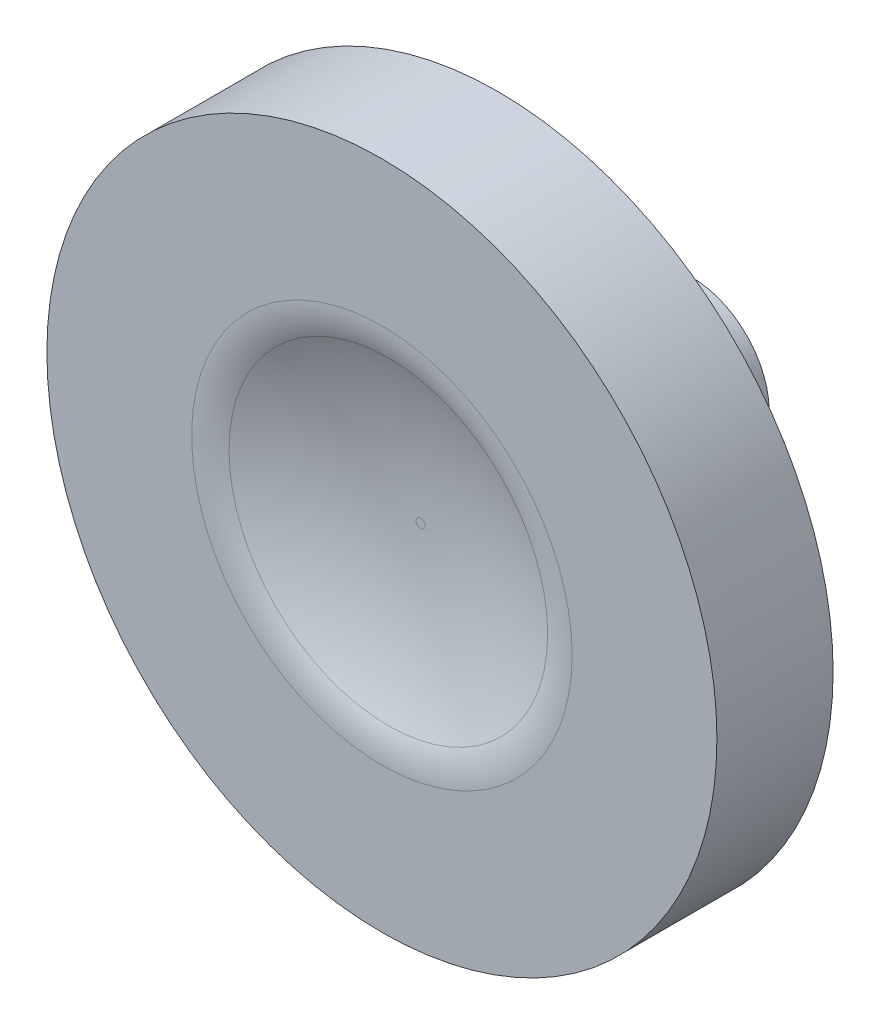
ISO-10303-21;
HEADER;
FILE_DESCRIPTION(('STEP AP214'),'2;1');
FILE_NAME('part.step','',(''),(''),'','','');
FILE_SCHEMA(('AUTOMOTIVE_DESIGN { 1 0 10303 214 1 1 1 1 }'));
ENDSEC;
DATA;
#1=APPLICATION_CONTEXT('core data for automotive mechanical design processes');
#2=APPLICATION_PROTOCOL_DEFINITION('international standard','automotive_design',2000,#1);
#3=PRODUCT_CONTEXT('',#1,'mechanical');
#4=PRODUCT('Part','Part','',(#3));
#5=PRODUCT_RELATED_PRODUCT_CATEGORY('part','',(#4));
#6=PRODUCT_DEFINITION_FORMATION('','',#4);
#7=PRODUCT_DEFINITION_CONTEXT('part definition',#1,'design');
#8=PRODUCT_DEFINITION('design','',#6,#7);
#9=PRODUCT_DEFINITION_SHAPE('','',#8);
#10=(LENGTH_UNIT() NAMED_UNIT(*) SI_UNIT(.MILLI.,.METRE.));
#11=(NAMED_UNIT(*) PLANE_ANGLE_UNIT() SI_UNIT($,.RADIAN.));
#12=(NAMED_UNIT(*) SI_UNIT($,.STERADIAN.) SOLID_ANGLE_UNIT());
#13=UNCERTAINTY_MEASURE_WITH_UNIT(LENGTH_MEASURE(1.E-05),#10,'distance_accuracy_value','');
#14=(GEOMETRIC_REPRESENTATION_CONTEXT(3) GLOBAL_UNCERTAINTY_ASSIGNED_CONTEXT((#13)) GLOBAL_UNIT_ASSIGNED_CONTEXT((#10,
#11,#12)) REPRESENTATION_CONTEXT('',''));
#15=CARTESIAN_POINT('',(0.,0.,0.));
#16=DIRECTION('',(0.,0.,1.));
#17=DIRECTION('',(1.,0.,0.));
#18=AXIS2_PLACEMENT_3D('',#15,#16,#17);
#19=CARTESIAN_POINT('',(0.,0.,2.54));
#20=DIRECTION('',(0.,0.,1.));
#21=DIRECTION('',(1.,0.,0.));
#22=AXIS2_PLACEMENT_3D('',#19,#20,#21);
#23=PLANE('',#22);
#24=CARTESIAN_POINT('',(0.,0.,2.54));
#25=DIRECTION('',(0.,0.,1.));
#26=DIRECTION('',(1.,0.,0.));
#27=AXIS2_PLACEMENT_3D('',#24,#25,#26);
#28=CIRCLE('',#27,0.14759849100532);
#29=CARTESIAN_POINT('',(0.14759849100532,0.,2.54));
#30=VERTEX_POINT('',#29);
#31=EDGE_CURVE('E41',#30,#30,#28,.T.);
#32=ORIENTED_EDGE('',*,*,#31,.T.);
#33=EDGE_LOOP('',(#32));
#34=FACE_BOUND('',#33,.T.);
#35=ADVANCED_FACE('F37',(#34),#23,.T.);
#36=CARTESIAN_POINT('',(0.,0.,3.81));
#37=DIRECTION('',(0.,0.,1.));
#38=DIRECTION('',(1.,0.,0.));
#39=AXIS2_PLACEMENT_3D('',#36,#37,#38);
#40=PLANE('',#39);
#41=CARTESIAN_POINT('',(0.,0.,3.81));
#42=DIRECTION('',(0.,0.,1.));
#43=DIRECTION('',(1.,0.,0.));
#44=AXIS2_PLACEMENT_3D('',#41,#42,#43);
#45=CIRCLE('',#44,6.23830452561247);
#46=CARTESIAN_POINT('',(6.23830452561247,0.,3.81));
#47=VERTEX_POINT('',#46);
#48=EDGE_CURVE('E63',#47,#47,#45,.F.);
#49=ORIENTED_EDGE('',*,*,#48,.T.);
#50=EDGE_LOOP('',(#49));
#51=FACE_BOUND('',#50,.T.);
#52=CARTESIAN_POINT('',(0.,0.,3.81));
#53=DIRECTION('',(0.,0.,1.));
#54=DIRECTION('',(1.,0.,0.));
#55=AXIS2_PLACEMENT_3D('',#52,#53,#54);
#56=CIRCLE('',#55,10.9855);
#57=CARTESIAN_POINT('',(-10.9855,0.,3.81));
#58=VERTEX_POINT('',#57);
#59=EDGE_CURVE('E60',#58,#58,#56,.T.);
#60=ORIENTED_EDGE('',*,*,#59,.T.);
#61=EDGE_LOOP('',(#60));
#62=FACE_BOUND('',#61,.T.);
#63=ADVANCED_FACE('F86',(#51,#62),#40,.T.);
#64=CARTESIAN_POINT('',(0.,0.,3.81));
#65=DIRECTION('',(0.,0.,-1.));
#66=DIRECTION('',(-1.,0.,0.));
#67=AXIS2_PLACEMENT_3D('',#64,#65,#66);
#68=CYLINDRICAL_SURFACE('',#67,10.9855);
#69=CARTESIAN_POINT('',(0.,0.,0.));
#70=DIRECTION('',(0.,0.,1.));
#71=DIRECTION('',(1.,0.,0.));
#72=AXIS2_PLACEMENT_3D('',#69,#70,#71);
#73=CIRCLE('',#72,10.9855);
#74=CARTESIAN_POINT('',(-10.9855,0.,0.));
#75=VERTEX_POINT('',#74);
#76=EDGE_CURVE('E56',#75,#75,#73,.T.);
#77=CARTESIAN_POINT('',(-10.9855,0.,3.81));
#78=CARTESIAN_POINT('',(-10.9855,0.,3.7703125));
#79=CARTESIAN_POINT('',(-10.9855,0.,3.730625));
#80=CARTESIAN_POINT('',(-10.9855,0.,3.65125));
#81=CARTESIAN_POINT('',(-10.9855,0.,3.6115625));
#82=CARTESIAN_POINT('',(-10.9855,0.,3.5321875));
#83=CARTESIAN_POINT('',(-10.9855,0.,3.4925));
#84=CARTESIAN_POINT('',(-10.9855,0.,3.413125));
#85=CARTESIAN_POINT('',(-10.9855,0.,3.3734375));
#86=CARTESIAN_POINT('',(-10.9855,0.,3.2940625));
#87=CARTESIAN_POINT('',(-10.9855,0.,3.254375));
#88=CARTESIAN_POINT('',(-10.9855,0.,3.175));
#89=CARTESIAN_POINT('',(-10.9855,0.,3.1353125));
#90=CARTESIAN_POINT('',(-10.9855,0.,3.0559375));
#91=CARTESIAN_POINT('',(-10.9855,0.,3.01625));
#92=CARTESIAN_POINT('',(-10.9855,0.,2.936875));
#93=CARTESIAN_POINT('',(-10.9855,0.,2.8971875));
#94=CARTESIAN_POINT('',(-10.9855,0.,2.8178125));
#95=CARTESIAN_POINT('',(-10.9855,0.,2.778125));
#96=CARTESIAN_POINT('',(-10.9855,0.,2.69875));
#97=CARTESIAN_POINT('',(-10.9855,0.,2.6590625));
#98=CARTESIAN_POINT('',(-10.9855,0.,2.5796875));
#99=CARTESIAN_POINT('',(-10.9855,0.,2.54));
#100=CARTESIAN_POINT('',(-10.9855,0.,2.460625));
#101=CARTESIAN_POINT('',(-10.9855,0.,2.4209375));
#102=CARTESIAN_POINT('',(-10.9855,0.,2.3415625));
#103=CARTESIAN_POINT('',(-10.9855,0.,2.301875));
#104=CARTESIAN_POINT('',(-10.9855,0.,2.2225));
#105=CARTESIAN_POINT('',(-10.9855,0.,2.1828125));
#106=CARTESIAN_POINT('',(-10.9855,0.,2.1034375));
#107=CARTESIAN_POINT('',(-10.9855,0.,2.06375));
#108=CARTESIAN_POINT('',(-10.9855,0.,1.984375));
#109=CARTESIAN_POINT('',(-10.9855,0.,1.9446875));
#110=CARTESIAN_POINT('',(-10.9855,0.,1.8653125));
#111=CARTESIAN_POINT('',(-10.9855,0.,1.825625));
#112=CARTESIAN_POINT('',(-10.9855,0.,1.74625));
#113=CARTESIAN_POINT('',(-10.9855,0.,1.7065625));
#114=CARTESIAN_POINT('',(-10.9855,0.,1.6271875));
#115=CARTESIAN_POINT('',(-10.9855,0.,1.5875));
#116=CARTESIAN_POINT('',(-10.9855,0.,1.508125));
#117=CARTESIAN_POINT('',(-10.9855,0.,1.4684375));
#118=CARTESIAN_POINT('',(-10.9855,0.,1.3890625));
#119=CARTESIAN_POINT('',(-10.9855,0.,1.349375));
#120=CARTESIAN_POINT('',(-10.9855,0.,1.27));
#121=CARTESIAN_POINT('',(-10.9855,0.,1.2303125));
#122=CARTESIAN_POINT('',(-10.9855,0.,1.1509375));
#123=CARTESIAN_POINT('',(-10.9855,0.,1.11125));
#124=CARTESIAN_POINT('',(-10.9855,0.,1.031875));
#125=CARTESIAN_POINT('',(-10.9855,0.,0.9921875));
#126=CARTESIAN_POINT('',(-10.9855,0.,0.9128125));
#127=CARTESIAN_POINT('',(-10.9855,0.,0.873125));
#128=CARTESIAN_POINT('',(-10.9855,0.,0.79375));
#129=CARTESIAN_POINT('',(-10.9855,0.,0.7540625));
#130=CARTESIAN_POINT('',(-10.9855,0.,0.6746875));
#131=CARTESIAN_POINT('',(-10.9855,0.,0.635));
#132=CARTESIAN_POINT('',(-10.9855,0.,0.555625));
#133=CARTESIAN_POINT('',(-10.9855,0.,0.5159375));
#134=CARTESIAN_POINT('',(-10.9855,0.,0.4365625));
#135=CARTESIAN_POINT('',(-10.9855,0.,0.396875));
#136=CARTESIAN_POINT('',(-10.9855,0.,0.3175));
#137=CARTESIAN_POINT('',(-10.9855,0.,0.2778125));
#138=CARTESIAN_POINT('',(-10.9855,0.,0.1984375));
#139=CARTESIAN_POINT('',(-10.9855,0.,0.15875));
#140=CARTESIAN_POINT('',(-10.9855,0.,0.0793749999999999));
#141=CARTESIAN_POINT('',(-10.9855,0.,0.0396874999999999));
#142=CARTESIAN_POINT('',(-10.9855,0.,0.));
#143=B_SPLINE_CURVE_WITH_KNOTS('',3,(#77,#78,#79,#80,#81,#82,#83,#84,#85,#86,#87,#88,#89,#90,
#91,#92,#93,#94,#95,#96,#97,#98,#99,#100,#101,#102,#103,#104,#105,#106,#107,#108,#109,#110,#111,
#112,#113,#114,#115,#116,#117,#118,#119,#120,#121,#122,#123,#124,#125,#126,#127,#128,#129,#130,
#131,#132,#133,#134,#135,#136,#137,#138,#139,#140,#141,#142),.UNSPECIFIED.,.F.,.F.,(4,2,2,2,2,2,
2,2,2,2,2,2,2,2,2,2,2,2,2,2,2,2,2,2,2,2,2,2,2,2,2,2,4),(0.,0.1190625,0.238125,0.3571875,0.47625,
0.5953125,0.714375,0.8334375,0.9525,1.0715625,1.190625,1.3096875,1.42875,1.5478125,1.666875,
1.7859375,1.905,2.0240625,2.143125,2.2621875,2.38125,2.5003125,2.619375,2.7384375,2.8575,
2.9765625,3.095625,3.2146875,3.33375,3.4528125,3.571875,3.6909375,3.81),.UNSPECIFIED.);
#144=EDGE_CURVE('BSEAM92',#58,#75,#143,.T.);
#145=ORIENTED_EDGE('',*,*,#59,.F.);
#146=ORIENTED_EDGE('',*,*,#76,.T.);
#147=ORIENTED_EDGE('',*,*,#144,.T.);
#148=ORIENTED_EDGE('',*,*,#144,.F.);
#149=EDGE_LOOP('',(#145,#147,#146,#148));
#150=FACE_BOUND('',#149,.T.);
#151=ADVANCED_FACE('F92',(#150),#68,.T.);
#152=CARTESIAN_POINT('',(0.,0.,0.));
#153=DIRECTION('',(0.,0.,1.));
#154=DIRECTION('',(1.,0.,0.));
#155=AXIS2_PLACEMENT_3D('',#152,#153,#154);
#156=PLANE('',#155);
#157=CARTESIAN_POINT('',(0.,0.,0.));
#158=DIRECTION('',(0.,0.,1.));
#159=DIRECTION('',(1.,0.,0.));
#160=AXIS2_PLACEMENT_3D('',#157,#158,#159);
#161=CIRCLE('',#160,4.0386);
#162=CARTESIAN_POINT('',(4.0386,0.,0.));
#163=VERTEX_POINT('',#162);
#164=EDGE_CURVE('E57',#163,#163,#161,.T.);
#165=ORIENTED_EDGE('',*,*,#164,.T.);
#166=EDGE_LOOP('',(#165));
#167=FACE_BOUND('',#166,.T.);
#168=ORIENTED_EDGE('',*,*,#76,.F.);
#169=EDGE_LOOP('',(#168));
#170=FACE_BOUND('',#169,.T.);
#171=ADVANCED_FACE('F83',(#167,#170),#156,.F.);
#172=CARTESIAN_POINT('',(0.,0.,1.27));
#173=DIRECTION('',(0.,0.,1.));
#174=DIRECTION('',(1.,0.,0.));
#175=AXIS2_PLACEMENT_3D('',#172,#173,#174);
#176=TOROIDAL_SURFACE('',#175,6.23830452561247,2.54);
#177=CARTESIAN_POINT('',(0.,0.,3.59833333333333));
#178=DIRECTION('',(0.,0.,-1.));
#179=DIRECTION('',(-1.,0.,0.));
#180=AXIS2_PLACEMENT_3D('',#177,#178,#179);
#181=CIRCLE('',#180,5.22318685317795);
#182=CARTESIAN_POINT('',(-5.22318685317795,0.,3.59833333333333));
#183=VERTEX_POINT('',#182);
#184=EDGE_CURVE('E49',#183,#183,#181,.T.);
#185=ORIENTED_EDGE('',*,*,#184,.T.);
#186=EDGE_LOOP('',(#185));
#187=FACE_BOUND('',#186,.T.);
#188=ORIENTED_EDGE('',*,*,#48,.F.);
#189=EDGE_LOOP('',(#188));
#190=FACE_BOUND('',#189,.T.);
#191=ADVANCED_FACE('F70',(#187,#190),#176,.T.);
#192=CARTESIAN_POINT('',(0.,0.,15.24));
#193=DIRECTION('',(0.,0.,-1.));
#194=DIRECTION('',(-1.,0.,0.));
#195=AXIS2_PLACEMENT_3D('',#192,#193,#194);
#196=DEGENERATE_TOROIDAL_SURFACE('',#195,0.14759849100532,12.7,.T.);
#197=ORIENTED_EDGE('',*,*,#31,.F.);
#198=EDGE_LOOP('',(#197));
#199=FACE_BOUND('',#198,.T.);
#200=ORIENTED_EDGE('',*,*,#184,.F.);
#201=EDGE_LOOP('',(#200));
#202=FACE_BOUND('',#201,.T.);
#203=ADVANCED_FACE('F39',(#199,#202),#196,.F.);
#204=CARTESIAN_POINT('',(0.,0.,-2.54));
#205=DIRECTION('',(0.,0.,1.));
#206=DIRECTION('',(1.,0.,0.));
#207=AXIS2_PLACEMENT_3D('',#204,#205,#206);
#208=CYLINDRICAL_SURFACE('',#207,4.0386);
#209=CARTESIAN_POINT('',(0.,0.,-2.54));
#210=DIRECTION('',(0.,0.,1.));
#211=DIRECTION('',(1.,0.,0.));
#212=AXIS2_PLACEMENT_3D('',#209,#210,#211);
#213=CIRCLE('',#212,4.0386);
#214=CARTESIAN_POINT('',(4.0386,0.,-2.54));
#215=VERTEX_POINT('',#214);
#216=EDGE_CURVE('E53',#215,#215,#213,.T.);
#217=ORIENTED_EDGE('',*,*,#216,.T.);
#218=EDGE_LOOP('',(#217));
#219=FACE_BOUND('',#218,.T.);
#220=ORIENTED_EDGE('',*,*,#164,.F.);
#221=EDGE_LOOP('',(#220));
#222=FACE_BOUND('',#221,.T.);
#223=ADVANCED_FACE('F74',(#219,#222),#208,.T.);
#224=CARTESIAN_POINT('',(0.,0.,-2.54));
#225=DIRECTION('',(0.,0.,1.));
#226=DIRECTION('',(1.,0.,0.));
#227=AXIS2_PLACEMENT_3D('',#224,#225,#226);
#228=PLANE('',#227);
#229=CARTESIAN_POINT('',(0.,0.,-2.54));
#230=DIRECTION('',(0.,0.,-1.));
#231=DIRECTION('',(-1.,0.,0.));
#232=AXIS2_PLACEMENT_3D('',#229,#230,#231);
#233=CIRCLE('',#232,2.54);
#234=CARTESIAN_POINT('',(2.54,0.,-2.54));
#235=VERTEX_POINT('',#234);
#236=EDGE_CURVE('E10',#235,#235,#233,.T.);
#237=ORIENTED_EDGE('',*,*,#236,.F.);
#238=EDGE_LOOP('',(#237));
#239=FACE_BOUND('',#238,.T.);
#240=ORIENTED_EDGE('',*,*,#216,.F.);
#241=EDGE_LOOP('',(#240));
#242=FACE_BOUND('',#241,.T.);
#243=ADVANCED_FACE('F80',(#239,#242),#228,.F.);
#244=CARTESIAN_POINT('',(0.,0.,-6.35));
#245=DIRECTION('',(0.,0.,1.));
#246=DIRECTION('',(1.,0.,0.));
#247=AXIS2_PLACEMENT_3D('',#244,#245,#246);
#248=CYLINDRICAL_SURFACE('',#247,2.54);
#249=CARTESIAN_POINT('',(0.,0.,-6.35));
#250=DIRECTION('',(0.,0.,-1.));
#251=DIRECTION('',(-1.,0.,0.));
#252=AXIS2_PLACEMENT_3D('',#249,#250,#251);
#253=CIRCLE('',#252,2.54);
#254=CARTESIAN_POINT('',(2.54,0.,-6.35));
#255=VERTEX_POINT('',#254);
#256=EDGE_CURVE('E52',#255,#255,#253,.T.);
#257=CARTESIAN_POINT('',(2.54,0.,-6.35));
#258=CARTESIAN_POINT('',(2.54,0.,-6.3103125));
#259=CARTESIAN_POINT('',(2.54,0.,-6.270625));
#260=CARTESIAN_POINT('',(2.54,0.,-6.19125));
#261=CARTESIAN_POINT('',(2.54,0.,-6.1515625));
#262=CARTESIAN_POINT('',(2.54,0.,-6.0721875));
#263=CARTESIAN_POINT('',(2.54,0.,-6.0325));
#264=CARTESIAN_POINT('',(2.54,0.,-5.953125));
#265=CARTESIAN_POINT('',(2.54,0.,-5.9134375));
#266=CARTESIAN_POINT('',(2.54,0.,-5.8340625));
#267=CARTESIAN_POINT('',(2.54,0.,-5.794375));
#268=CARTESIAN_POINT('',(2.54,0.,-5.715));
#269=CARTESIAN_POINT('',(2.54,0.,-5.6753125));
#270=CARTESIAN_POINT('',(2.54,0.,-5.5959375));
#271=CARTESIAN_POINT('',(2.54,0.,-5.55625));
#272=CARTESIAN_POINT('',(2.54,0.,-5.476875));
#273=CARTESIAN_POINT('',(2.54,0.,-5.4371875));
#274=CARTESIAN_POINT('',(2.54,0.,-5.3578125));
#275=CARTESIAN_POINT('',(2.54,0.,-5.318125));
#276=CARTESIAN_POINT('',(2.54,0.,-5.23875));
#277=CARTESIAN_POINT('',(2.54,0.,-5.1990625));
#278=CARTESIAN_POINT('',(2.54,0.,-5.1196875));
#279=CARTESIAN_POINT('',(2.54,0.,-5.08));
#280=CARTESIAN_POINT('',(2.54,0.,-5.000625));
#281=CARTESIAN_POINT('',(2.54,0.,-4.9609375));
#282=CARTESIAN_POINT('',(2.54,0.,-4.8815625));
#283=CARTESIAN_POINT('',(2.54,0.,-4.841875));
#284=CARTESIAN_POINT('',(2.54,0.,-4.7625));
#285=CARTESIAN_POINT('',(2.54,0.,-4.7228125));
#286=CARTESIAN_POINT('',(2.54,0.,-4.6434375));
#287=CARTESIAN_POINT('',(2.54,0.,-4.60375));
#288=CARTESIAN_POINT('',(2.54,0.,-4.524375));
#289=CARTESIAN_POINT('',(2.54,0.,-4.4846875));
#290=CARTESIAN_POINT('',(2.54,0.,-4.4053125));
#291=CARTESIAN_POINT('',(2.54,0.,-4.365625));
#292=CARTESIAN_POINT('',(2.54,0.,-4.28625));
#293=CARTESIAN_POINT('',(2.54,0.,-4.2465625));
#294=CARTESIAN_POINT('',(2.54,0.,-4.1671875));
#295=CARTESIAN_POINT('',(2.54,0.,-4.1275));
#296=CARTESIAN_POINT('',(2.54,0.,-4.048125));
#297=CARTESIAN_POINT('',(2.54,0.,-4.0084375));
#298=CARTESIAN_POINT('',(2.54,0.,-3.9290625));
#299=CARTESIAN_POINT('',(2.54,0.,-3.889375));
#300=CARTESIAN_POINT('',(2.54,0.,-3.81));
#301=CARTESIAN_POINT('',(2.54,0.,-3.7703125));
#302=CARTESIAN_POINT('',(2.54,0.,-3.6909375));
#303=CARTESIAN_POINT('',(2.54,0.,-3.65125));
#304=CARTESIAN_POINT('',(2.54,0.,-3.571875));
#305=CARTESIAN_POINT('',(2.54,0.,-3.5321875));
#306=CARTESIAN_POINT('',(2.54,0.,-3.4528125));
#307=CARTESIAN_POINT('',(2.54,0.,-3.413125));
#308=CARTESIAN_POINT('',(2.54,0.,-3.33375));
#309=CARTESIAN_POINT('',(2.54,0.,-3.2940625));
#310=CARTESIAN_POINT('',(2.54,0.,-3.2146875));
#311=CARTESIAN_POINT('',(2.54,0.,-3.175));
#312=CARTESIAN_POINT('',(2.54,0.,-3.095625));
#313=CARTESIAN_POINT('',(2.54,0.,-3.0559375));
#314=CARTESIAN_POINT('',(2.54,0.,-2.9765625));
#315=CARTESIAN_POINT('',(2.54,0.,-2.936875));
#316=CARTESIAN_POINT('',(2.54,0.,-2.8575));
#317=CARTESIAN_POINT('',(2.54,0.,-2.8178125));
#318=CARTESIAN_POINT('',(2.54,0.,-2.7384375));
#319=CARTESIAN_POINT('',(2.54,0.,-2.69875));
#320=CARTESIAN_POINT('',(2.54,0.,-2.619375));
#321=CARTESIAN_POINT('',(2.54,0.,-2.5796875));
#322=CARTESIAN_POINT('',(2.54,0.,-2.54));
#323=B_SPLINE_CURVE_WITH_KNOTS('',3,(#257,#258,#259,#260,#261,#262,#263,#264,#265,#266,#267,
#268,#269,#270,#271,#272,#273,#274,#275,#276,#277,#278,#279,#280,#281,#282,#283,#284,#285,#286,
#287,#288,#289,#290,#291,#292,#293,#294,#295,#296,#297,#298,#299,#300,#301,#302,#303,#304,#305,
#306,#307,#308,#309,#310,#311,#312,#313,#314,#315,#316,#317,#318,#319,#320,#321,#322),
.UNSPECIFIED.,.F.,.F.,(4,2,2,2,2,2,2,2,2,2,2,2,2,2,2,2,2,2,2,2,2,2,2,2,2,2,2,2,2,2,2,2,4),(0.,
0.1190625,0.238125,0.357187500000001,0.47625,0.5953125,0.714375000000001,0.8334375,0.9525,
1.0715625,1.190625,1.3096875,1.42875,1.5478125,1.666875,1.7859375,1.905,2.0240625,2.143125,
2.2621875,2.38125,2.5003125,2.619375,2.7384375,2.8575,2.9765625,3.095625,3.2146875,3.33375,
3.4528125,3.571875,3.6909375,3.81),.UNSPECIFIED.);
#324=EDGE_CURVE('BSEAM164',#255,#235,#323,.T.);
#325=ORIENTED_EDGE('',*,*,#256,.F.);
#326=ORIENTED_EDGE('',*,*,#236,.T.);
#327=ORIENTED_EDGE('',*,*,#324,.T.);
#328=ORIENTED_EDGE('',*,*,#324,.F.);
#329=EDGE_LOOP('',(#325,#327,#326,#328));
#330=FACE_BOUND('',#329,.T.);
#331=ADVANCED_FACE('F164',(#330),#248,.T.);
#332=CARTESIAN_POINT('',(0.,0.,-6.35));
#333=DIRECTION('',(0.,0.,-1.));
#334=DIRECTION('',(-1.,0.,0.));
#335=AXIS2_PLACEMENT_3D('',#332,#333,#334);
#336=PLANE('',#335);
#337=ORIENTED_EDGE('',*,*,#256,.T.);
#338=EDGE_LOOP('',(#337));
#339=FACE_BOUND('',#338,.T.);
#340=ADVANCED_FACE('F176',(#339),#336,.T.);
#341=CLOSED_SHELL('',(#35,#63,#151,#171,#191,#203,#223,#243,#331,#340));
#342=MANIFOLD_SOLID_BREP('B2',#341);
#343=ADVANCED_BREP_SHAPE_REPRESENTATION('',(#18,#342),#14);
#344=SHAPE_DEFINITION_REPRESENTATION(#9,#343);
ENDSEC;
END-ISO-10303-21;
